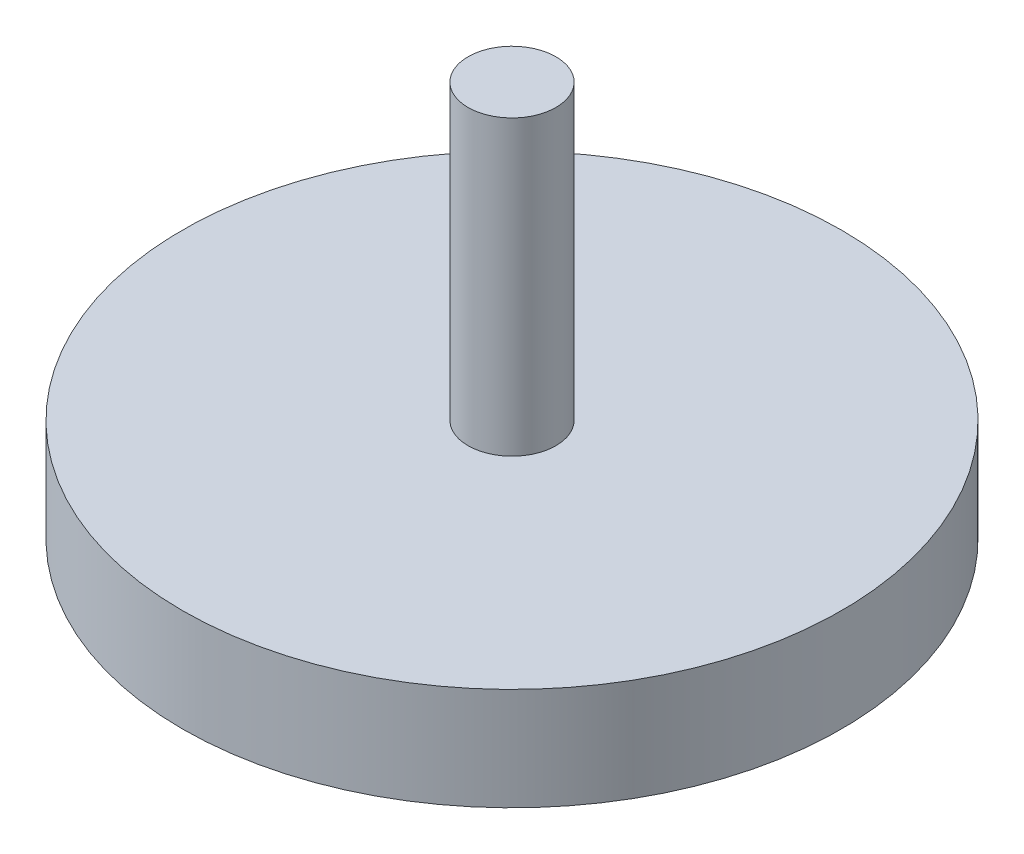
ISO-10303-21;
HEADER;
FILE_DESCRIPTION(('STEP AP214'),'2;1');
FILE_NAME('part.step','',(''),(''),'','','');
FILE_SCHEMA(('AUTOMOTIVE_DESIGN { 1 0 10303 214 1 1 1 1 }'));
ENDSEC;
DATA;
#1=APPLICATION_CONTEXT('core data for automotive mechanical design processes');
#2=APPLICATION_PROTOCOL_DEFINITION('international standard','automotive_design',2000,#1);
#3=PRODUCT_CONTEXT('',#1,'mechanical');
#4=PRODUCT('Part','Part','',(#3));
#5=PRODUCT_RELATED_PRODUCT_CATEGORY('part','',(#4));
#6=PRODUCT_DEFINITION_FORMATION('','',#4);
#7=PRODUCT_DEFINITION_CONTEXT('part definition',#1,'design');
#8=PRODUCT_DEFINITION('design','',#6,#7);
#9=PRODUCT_DEFINITION_SHAPE('','',#8);
#10=(LENGTH_UNIT() NAMED_UNIT(*) SI_UNIT(.MILLI.,.METRE.));
#11=(NAMED_UNIT(*) PLANE_ANGLE_UNIT() SI_UNIT($,.RADIAN.));
#12=(NAMED_UNIT(*) SI_UNIT($,.STERADIAN.) SOLID_ANGLE_UNIT());
#13=UNCERTAINTY_MEASURE_WITH_UNIT(LENGTH_MEASURE(1.E-05),#10,'distance_accuracy_value','');
#14=(GEOMETRIC_REPRESENTATION_CONTEXT(3) GLOBAL_UNCERTAINTY_ASSIGNED_CONTEXT((#13)) GLOBAL_UNIT_ASSIGNED_CONTEXT((#10,
#11,#12)) REPRESENTATION_CONTEXT('',''));
#15=CARTESIAN_POINT('',(0.,0.,0.));
#16=DIRECTION('',(0.,0.,1.));
#17=DIRECTION('',(1.,0.,0.));
#18=AXIS2_PLACEMENT_3D('',#15,#16,#17);
#19=CARTESIAN_POINT('',(0.,7.,0.));
#20=DIRECTION('',(0.,-1.,0.));
#21=DIRECTION('',(0.,0.,-1.));
#22=AXIS2_PLACEMENT_3D('',#19,#20,#21);
#23=CYLINDRICAL_SURFACE('',#22,22.5);
#24=CARTESIAN_POINT('',(0.,7.,0.));
#25=DIRECTION('',(0.,1.,0.));
#26=DIRECTION('',(0.,0.,1.));
#27=AXIS2_PLACEMENT_3D('',#24,#25,#26);
#28=CIRCLE('',#27,22.5);
#29=CARTESIAN_POINT('',(0.,7.,22.5));
#30=VERTEX_POINT('',#29);
#31=EDGE_CURVE('E11',#30,#30,#28,.T.);
#32=ORIENTED_EDGE('',*,*,#31,.F.);
#33=EDGE_LOOP('',(#32));
#34=FACE_BOUND('',#33,.T.);
#35=CARTESIAN_POINT('',(0.,0.,0.));
#36=DIRECTION('',(0.,1.,0.));
#37=DIRECTION('',(0.,0.,1.));
#38=AXIS2_PLACEMENT_3D('',#35,#36,#37);
#39=CIRCLE('',#38,22.5);
#40=CARTESIAN_POINT('',(0.,0.,22.5));
#41=VERTEX_POINT('',#40);
#42=EDGE_CURVE('E42',#41,#41,#39,.T.);
#43=ORIENTED_EDGE('',*,*,#42,.T.);
#44=EDGE_LOOP('',(#43));
#45=FACE_BOUND('',#44,.T.);
#46=ADVANCED_FACE('F39',(#34,#45),#23,.T.);
#47=CARTESIAN_POINT('',(0.,7.,0.));
#48=DIRECTION('',(0.,1.,0.));
#49=DIRECTION('',(0.,0.,1.));
#50=AXIS2_PLACEMENT_3D('',#47,#48,#49);
#51=PLANE('',#50);
#52=CARTESIAN_POINT('',(0.,7.,0.));
#53=DIRECTION('',(0.,1.,0.));
#54=DIRECTION('',(0.,0.,1.));
#55=AXIS2_PLACEMENT_3D('',#52,#53,#54);
#56=CIRCLE('',#55,3.);
#57=CARTESIAN_POINT('',(0.,7.,3.));
#58=VERTEX_POINT('',#57);
#59=EDGE_CURVE('E153',#58,#58,#56,.T.);
#60=ORIENTED_EDGE('',*,*,#59,.F.);
#61=EDGE_LOOP('',(#60));
#62=FACE_BOUND('',#61,.T.);
#63=ORIENTED_EDGE('',*,*,#31,.T.);
#64=EDGE_LOOP('',(#63));
#65=FACE_BOUND('',#64,.T.);
#66=ADVANCED_FACE('F173',(#62,#65),#51,.T.);
#67=CARTESIAN_POINT('',(0.,0.,0.));
#68=DIRECTION('',(0.,1.,0.));
#69=DIRECTION('',(0.,0.,1.));
#70=AXIS2_PLACEMENT_3D('',#67,#68,#69);
#71=PLANE('',#70);
#72=DIRECTION('',(0.,0.,1.));
#73=VECTOR('',#72,1.);
#74=CARTESIAN_POINT('',(4.76313972081441,0.,-2.75));
#75=LINE('',#74,#73);
#76=CARTESIAN_POINT('',(4.76313972081441,0.,-2.75));
#77=VERTEX_POINT('',#76);
#78=CARTESIAN_POINT('',(4.76313972081441,0.,2.75));
#79=VERTEX_POINT('',#78);
#80=EDGE_CURVE('E134',#77,#79,#75,.T.);
#81=ORIENTED_EDGE('',*,*,#80,.F.);
#82=DIRECTION('',(0.866025403784439,0.,0.5));
#83=VECTOR('',#82,1.);
#84=CARTESIAN_POINT('',(0.,0.,-5.5));
#85=LINE('',#84,#83);
#86=CARTESIAN_POINT('',(0.,0.,-5.5));
#87=VERTEX_POINT('',#86);
#88=EDGE_CURVE('E54',#87,#77,#85,.T.);
#89=ORIENTED_EDGE('',*,*,#88,.F.);
#90=DIRECTION('',(0.866025403784439,0.,-0.5));
#91=VECTOR('',#90,1.);
#92=CARTESIAN_POINT('',(-4.76313972081441,0.,-2.75));
#93=LINE('',#92,#91);
#94=CARTESIAN_POINT('',(-4.76313972081441,0.,-2.75));
#95=VERTEX_POINT('',#94);
#96=EDGE_CURVE('E147',#95,#87,#93,.T.);
#97=ORIENTED_EDGE('',*,*,#96,.F.);
#98=DIRECTION('',(0.,0.,-1.));
#99=VECTOR('',#98,1.);
#100=CARTESIAN_POINT('',(-4.76313972081441,0.,2.75));
#101=LINE('',#100,#99);
#102=CARTESIAN_POINT('',(-4.76313972081441,0.,2.75));
#103=VERTEX_POINT('',#102);
#104=EDGE_CURVE('E144',#103,#95,#101,.T.);
#105=ORIENTED_EDGE('',*,*,#104,.F.);
#106=DIRECTION('',(-0.866025403784439,0.,-0.5));
#107=VECTOR('',#106,1.);
#108=CARTESIAN_POINT('',(0.,0.,5.5));
#109=LINE('',#108,#107);
#110=CARTESIAN_POINT('',(0.,0.,5.5));
#111=VERTEX_POINT('',#110);
#112=EDGE_CURVE('E102',#111,#103,#109,.T.);
#113=ORIENTED_EDGE('',*,*,#112,.F.);
#114=DIRECTION('',(-0.866025403784439,0.,0.5));
#115=VECTOR('',#114,1.);
#116=CARTESIAN_POINT('',(4.76313972081441,0.,2.75));
#117=LINE('',#116,#115);
#118=EDGE_CURVE('E138',#79,#111,#117,.T.);
#119=ORIENTED_EDGE('',*,*,#118,.F.);
#120=EDGE_LOOP('',(#81,#89,#97,#105,#113,#119));
#121=FACE_BOUND('',#120,.T.);
#122=ORIENTED_EDGE('',*,*,#42,.F.);
#123=EDGE_LOOP('',(#122));
#124=FACE_BOUND('',#123,.T.);
#125=ADVANCED_FACE('F176',(#121,#124),#71,.F.);
#126=CARTESIAN_POINT('',(0.,27.,0.));
#127=DIRECTION('',(0.,-1.,0.));
#128=DIRECTION('',(0.,0.,-1.));
#129=AXIS2_PLACEMENT_3D('',#126,#127,#128);
#130=CYLINDRICAL_SURFACE('',#129,3.);
#131=CARTESIAN_POINT('',(0.,27.,0.));
#132=DIRECTION('',(0.,1.,0.));
#133=DIRECTION('',(0.,0.,1.));
#134=AXIS2_PLACEMENT_3D('',#131,#132,#133);
#135=CIRCLE('',#134,3.);
#136=CARTESIAN_POINT('',(0.,27.,3.));
#137=VERTEX_POINT('',#136);
#138=EDGE_CURVE('E163',#137,#137,#135,.T.);
#139=ORIENTED_EDGE('',*,*,#138,.F.);
#140=EDGE_LOOP('',(#139));
#141=FACE_BOUND('',#140,.T.);
#142=ORIENTED_EDGE('',*,*,#59,.T.);
#143=EDGE_LOOP('',(#142));
#144=FACE_BOUND('',#143,.T.);
#145=ADVANCED_FACE('F171',(#141,#144),#130,.T.);
#146=CARTESIAN_POINT('',(0.,27.,0.));
#147=DIRECTION('',(0.,1.,0.));
#148=DIRECTION('',(0.,0.,1.));
#149=AXIS2_PLACEMENT_3D('',#146,#147,#148);
#150=PLANE('',#149);
#151=ORIENTED_EDGE('',*,*,#138,.T.);
#152=EDGE_LOOP('',(#151));
#153=FACE_BOUND('',#152,.T.);
#154=ADVANCED_FACE('F191',(#153),#150,.T.);
#155=CARTESIAN_POINT('',(0.,5.,-5.5));
#156=DIRECTION('',(0.5,0.,-0.866025403784439));
#157=DIRECTION('',(-0.866025403784439,0.,-0.5));
#158=AXIS2_PLACEMENT_3D('',#155,#156,#157);
#159=PLANE('',#158);
#160=ORIENTED_EDGE('',*,*,#88,.T.);
#161=DIRECTION('',(0.,-1.,0.));
#162=VECTOR('',#161,1.);
#163=CARTESIAN_POINT('',(4.76313972081441,5.,-2.75));
#164=LINE('',#163,#162);
#165=CARTESIAN_POINT('',(4.76313972081441,5.,-2.75));
#166=VERTEX_POINT('',#165);
#167=EDGE_CURVE('E84',#166,#77,#164,.T.);
#168=ORIENTED_EDGE('',*,*,#167,.F.);
#169=DIRECTION('',(0.866025403784439,0.,0.5));
#170=VECTOR('',#169,1.);
#171=CARTESIAN_POINT('',(0.,5.,-5.5));
#172=LINE('',#171,#170);
#173=CARTESIAN_POINT('',(0.,5.,-5.5));
#174=VERTEX_POINT('',#173);
#175=EDGE_CURVE('E150',#174,#166,#172,.T.);
#176=ORIENTED_EDGE('',*,*,#175,.F.);
#177=DIRECTION('',(0.,-1.,0.));
#178=VECTOR('',#177,1.);
#179=CARTESIAN_POINT('',(0.,5.,-5.5));
#180=LINE('',#179,#178);
#181=EDGE_CURVE('E62',#174,#87,#180,.T.);
#182=ORIENTED_EDGE('',*,*,#181,.T.);
#183=EDGE_LOOP('',(#160,#168,#176,#182));
#184=FACE_BOUND('',#183,.T.);
#185=ADVANCED_FACE('F198',(#184),#159,.F.);
#186=CARTESIAN_POINT('',(-4.76313972081441,5.,-2.75));
#187=DIRECTION('',(-0.5,0.,-0.866025403784438));
#188=DIRECTION('',(-0.866025403784439,0.,0.5));
#189=AXIS2_PLACEMENT_3D('',#186,#187,#188);
#190=PLANE('',#189);
#191=ORIENTED_EDGE('',*,*,#96,.T.);
#192=ORIENTED_EDGE('',*,*,#181,.F.);
#193=DIRECTION('',(0.866025403784439,0.,-0.5));
#194=VECTOR('',#193,1.);
#195=CARTESIAN_POINT('',(-4.76313972081441,5.,-2.75));
#196=LINE('',#195,#194);
#197=CARTESIAN_POINT('',(-4.76313972081441,5.,-2.75));
#198=VERTEX_POINT('',#197);
#199=EDGE_CURVE('E116',#198,#174,#196,.T.);
#200=ORIENTED_EDGE('',*,*,#199,.F.);
#201=DIRECTION('',(0.,-1.,0.));
#202=VECTOR('',#201,1.);
#203=CARTESIAN_POINT('',(-4.76313972081441,5.,-2.75));
#204=LINE('',#203,#202);
#205=EDGE_CURVE('E107',#198,#95,#204,.T.);
#206=ORIENTED_EDGE('',*,*,#205,.T.);
#207=EDGE_LOOP('',(#191,#192,#200,#206));
#208=FACE_BOUND('',#207,.T.);
#209=ADVANCED_FACE('F202',(#208),#190,.F.);
#210=CARTESIAN_POINT('',(-4.76313972081441,5.,2.75));
#211=DIRECTION('',(-1.,0.,0.));
#212=DIRECTION('',(0.,0.,1.));
#213=AXIS2_PLACEMENT_3D('',#210,#211,#212);
#214=PLANE('',#213);
#215=ORIENTED_EDGE('',*,*,#104,.T.);
#216=ORIENTED_EDGE('',*,*,#205,.F.);
#217=DIRECTION('',(0.,0.,-1.));
#218=VECTOR('',#217,1.);
#219=CARTESIAN_POINT('',(-4.76313972081441,5.,2.75));
#220=LINE('',#219,#218);
#221=CARTESIAN_POINT('',(-4.76313972081441,5.,2.75));
#222=VERTEX_POINT('',#221);
#223=EDGE_CURVE('E111',#222,#198,#220,.T.);
#224=ORIENTED_EDGE('',*,*,#223,.F.);
#225=DIRECTION('',(0.,-1.,0.));
#226=VECTOR('',#225,1.);
#227=CARTESIAN_POINT('',(-4.76313972081441,5.,2.75));
#228=LINE('',#227,#226);
#229=EDGE_CURVE('E95',#222,#103,#228,.T.);
#230=ORIENTED_EDGE('',*,*,#229,.T.);
#231=EDGE_LOOP('',(#215,#216,#224,#230));
#232=FACE_BOUND('',#231,.T.);
#233=ADVANCED_FACE('F112',(#232),#214,.F.);
#234=CARTESIAN_POINT('',(0.,5.,5.5));
#235=DIRECTION('',(-0.5,0.,0.866025403784439));
#236=DIRECTION('',(0.866025403784439,0.,0.5));
#237=AXIS2_PLACEMENT_3D('',#234,#235,#236);
#238=PLANE('',#237);
#239=ORIENTED_EDGE('',*,*,#112,.T.);
#240=ORIENTED_EDGE('',*,*,#229,.F.);
#241=DIRECTION('',(-0.866025403784439,0.,-0.5));
#242=VECTOR('',#241,1.);
#243=CARTESIAN_POINT('',(0.,5.,5.5));
#244=LINE('',#243,#242);
#245=CARTESIAN_POINT('',(0.,5.,5.5));
#246=VERTEX_POINT('',#245);
#247=EDGE_CURVE('E99',#246,#222,#244,.T.);
#248=ORIENTED_EDGE('',*,*,#247,.F.);
#249=DIRECTION('',(0.,-1.,0.));
#250=VECTOR('',#249,1.);
#251=CARTESIAN_POINT('',(0.,5.,5.5));
#252=LINE('',#251,#250);
#253=EDGE_CURVE('E108',#246,#111,#252,.T.);
#254=ORIENTED_EDGE('',*,*,#253,.T.);
#255=EDGE_LOOP('',(#239,#240,#248,#254));
#256=FACE_BOUND('',#255,.T.);
#257=ADVANCED_FACE('F97',(#256),#238,.F.);
#258=CARTESIAN_POINT('',(4.76313972081441,5.,2.75));
#259=DIRECTION('',(0.5,0.,0.866025403784439));
#260=DIRECTION('',(0.866025403784439,0.,-0.5));
#261=AXIS2_PLACEMENT_3D('',#258,#259,#260);
#262=PLANE('',#261);
#263=ORIENTED_EDGE('',*,*,#118,.T.);
#264=ORIENTED_EDGE('',*,*,#253,.F.);
#265=DIRECTION('',(-0.866025403784439,0.,0.5));
#266=VECTOR('',#265,1.);
#267=CARTESIAN_POINT('',(4.76313972081441,5.,2.75));
#268=LINE('',#267,#266);
#269=CARTESIAN_POINT('',(4.76313972081441,5.,2.75));
#270=VERTEX_POINT('',#269);
#271=EDGE_CURVE('E122',#270,#246,#268,.T.);
#272=ORIENTED_EDGE('',*,*,#271,.F.);
#273=DIRECTION('',(0.,-1.,0.));
#274=VECTOR('',#273,1.);
#275=CARTESIAN_POINT('',(4.76313972081441,5.,2.75));
#276=LINE('',#275,#274);
#277=EDGE_CURVE('E158',#270,#79,#276,.T.);
#278=ORIENTED_EDGE('',*,*,#277,.T.);
#279=EDGE_LOOP('',(#263,#264,#272,#278));
#280=FACE_BOUND('',#279,.T.);
#281=ADVANCED_FACE('F206',(#280),#262,.F.);
#282=CARTESIAN_POINT('',(4.76313972081441,5.,-2.75));
#283=DIRECTION('',(1.,0.,0.));
#284=DIRECTION('',(0.,0.,-1.));
#285=AXIS2_PLACEMENT_3D('',#282,#283,#284);
#286=PLANE('',#285);
#287=ORIENTED_EDGE('',*,*,#80,.T.);
#288=ORIENTED_EDGE('',*,*,#277,.F.);
#289=DIRECTION('',(0.,0.,1.));
#290=VECTOR('',#289,1.);
#291=CARTESIAN_POINT('',(4.76313972081441,5.,-2.75));
#292=LINE('',#291,#290);
#293=EDGE_CURVE('E126',#166,#270,#292,.T.);
#294=ORIENTED_EDGE('',*,*,#293,.F.);
#295=ORIENTED_EDGE('',*,*,#167,.T.);
#296=EDGE_LOOP('',(#287,#288,#294,#295));
#297=FACE_BOUND('',#296,.T.);
#298=ADVANCED_FACE('F203',(#297),#286,.F.);
#299=CARTESIAN_POINT('',(0.,5.,0.));
#300=DIRECTION('',(0.,-1.,0.));
#301=DIRECTION('',(0.,0.,-1.));
#302=AXIS2_PLACEMENT_3D('',#299,#300,#301);
#303=PLANE('',#302);
#304=ORIENTED_EDGE('',*,*,#175,.T.);
#305=ORIENTED_EDGE('',*,*,#293,.T.);
#306=ORIENTED_EDGE('',*,*,#271,.T.);
#307=ORIENTED_EDGE('',*,*,#247,.T.);
#308=ORIENTED_EDGE('',*,*,#223,.T.);
#309=ORIENTED_EDGE('',*,*,#199,.T.);
#310=EDGE_LOOP('',(#304,#305,#306,#307,#308,#309));
#311=FACE_BOUND('',#310,.T.);
#312=ADVANCED_FACE('F119',(#311),#303,.T.);
#313=CLOSED_SHELL('',(#46,#66,#125,#145,#154,#185,#209,#233,#257,#281,#298,#312));
#314=MANIFOLD_SOLID_BREP('B2',#313);
#315=ADVANCED_BREP_SHAPE_REPRESENTATION('',(#18,#314),#14);
#316=SHAPE_DEFINITION_REPRESENTATION(#9,#315);
ENDSEC;
END-ISO-10303-21;
